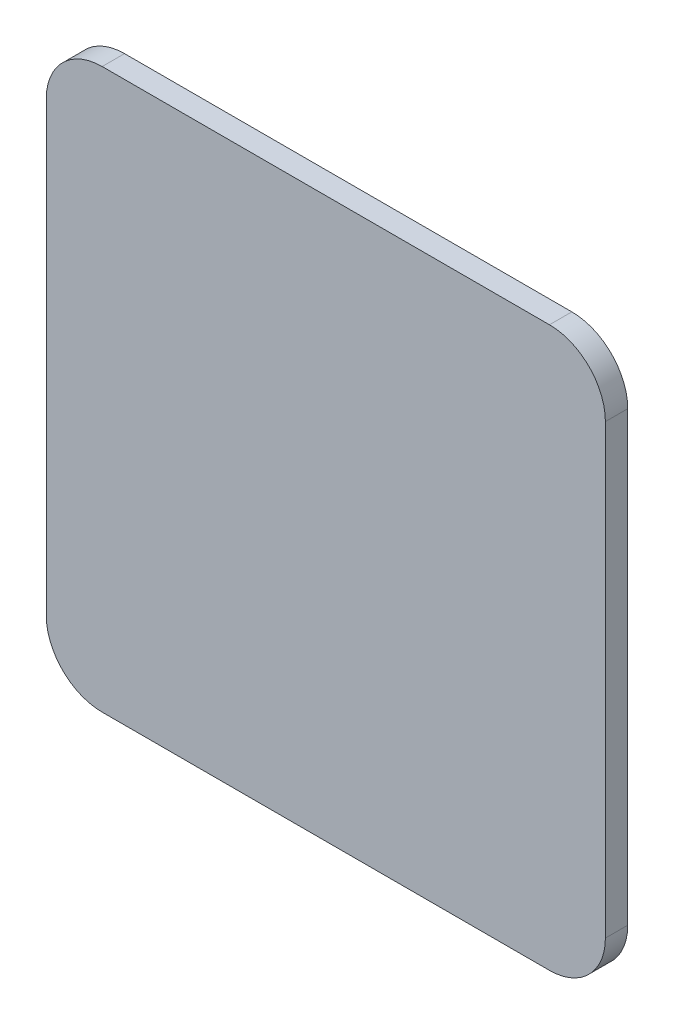
ISO-10303-21;
HEADER;
FILE_DESCRIPTION(('STEP AP214'),'2;1');
FILE_NAME('part.step','',(''),(''),'','','');
FILE_SCHEMA(('AUTOMOTIVE_DESIGN { 1 0 10303 214 1 1 1 1 }'));
ENDSEC;
DATA;
#1=APPLICATION_CONTEXT('core data for automotive mechanical design processes');
#2=APPLICATION_PROTOCOL_DEFINITION('international standard','automotive_design',2000,#1);
#3=PRODUCT_CONTEXT('',#1,'mechanical');
#4=PRODUCT('Part','Part','',(#3));
#5=PRODUCT_RELATED_PRODUCT_CATEGORY('part','',(#4));
#6=PRODUCT_DEFINITION_FORMATION('','',#4);
#7=PRODUCT_DEFINITION_CONTEXT('part definition',#1,'design');
#8=PRODUCT_DEFINITION('design','',#6,#7);
#9=PRODUCT_DEFINITION_SHAPE('','',#8);
#10=(LENGTH_UNIT() NAMED_UNIT(*) SI_UNIT(.MILLI.,.METRE.));
#11=(NAMED_UNIT(*) PLANE_ANGLE_UNIT() SI_UNIT($,.RADIAN.));
#12=(NAMED_UNIT(*) SI_UNIT($,.STERADIAN.) SOLID_ANGLE_UNIT());
#13=UNCERTAINTY_MEASURE_WITH_UNIT(LENGTH_MEASURE(1.E-05),#10,'distance_accuracy_value','');
#14=(GEOMETRIC_REPRESENTATION_CONTEXT(3) GLOBAL_UNCERTAINTY_ASSIGNED_CONTEXT((#13)) GLOBAL_UNIT_ASSIGNED_CONTEXT((#10,
#11,#12)) REPRESENTATION_CONTEXT('',''));
#15=CARTESIAN_POINT('',(0.,0.,0.));
#16=DIRECTION('',(0.,0.,1.));
#17=DIRECTION('',(1.,0.,0.));
#18=AXIS2_PLACEMENT_3D('',#15,#16,#17);
#19=CARTESIAN_POINT('',(0.,0.,0.4));
#20=DIRECTION('',(1.,0.,0.));
#21=DIRECTION('',(0.,0.,-1.));
#22=AXIS2_PLACEMENT_3D('',#19,#20,#21);
#23=PLANE('',#22);
#24=DIRECTION('',(0.,-1.,0.));
#25=VECTOR('',#24,1.);
#26=CARTESIAN_POINT('',(0.,0.,0.));
#27=LINE('',#26,#25);
#28=CARTESIAN_POINT('',(0.,9.,0.));
#29=VERTEX_POINT('',#28);
#30=CARTESIAN_POINT('',(0.,1.,0.));
#31=VERTEX_POINT('',#30);
#32=EDGE_CURVE('E130',#29,#31,#27,.T.);
#33=ORIENTED_EDGE('',*,*,#32,.T.);
#34=DIRECTION('',(0.,0.,-1.));
#35=VECTOR('',#34,1.);
#36=CARTESIAN_POINT('',(0.,1.,0.4));
#37=LINE('',#36,#35);
#38=CARTESIAN_POINT('',(0.,1.,0.4));
#39=VERTEX_POINT('',#38);
#40=EDGE_CURVE('E152',#31,#39,#37,.F.);
#41=ORIENTED_EDGE('',*,*,#40,.T.);
#42=DIRECTION('',(0.,-1.,0.));
#43=VECTOR('',#42,1.);
#44=CARTESIAN_POINT('',(0.,0.,0.4));
#45=LINE('',#44,#43);
#46=CARTESIAN_POINT('',(0.,9.,0.4));
#47=VERTEX_POINT('',#46);
#48=EDGE_CURVE('E128',#47,#39,#45,.T.);
#49=ORIENTED_EDGE('',*,*,#48,.F.);
#50=DIRECTION('',(0.,0.,-1.));
#51=VECTOR('',#50,1.);
#52=CARTESIAN_POINT('',(0.,9.,0.4));
#53=LINE('',#52,#51);
#54=EDGE_CURVE('E149',#47,#29,#53,.T.);
#55=ORIENTED_EDGE('',*,*,#54,.T.);
#56=EDGE_LOOP('',(#33,#41,#49,#55));
#57=FACE_BOUND('',#56,.T.);
#58=ADVANCED_FACE('F33',(#57),#23,.F.);
#59=CARTESIAN_POINT('',(0.,0.,0.4));
#60=DIRECTION('',(0.,1.,0.));
#61=DIRECTION('',(0.,0.,1.));
#62=AXIS2_PLACEMENT_3D('',#59,#60,#61);
#63=PLANE('',#62);
#64=DIRECTION('',(1.,0.,0.));
#65=VECTOR('',#64,1.);
#66=CARTESIAN_POINT('',(0.,0.,0.));
#67=LINE('',#66,#65);
#68=CARTESIAN_POINT('',(1.,0.,0.));
#69=VERTEX_POINT('',#68);
#70=CARTESIAN_POINT('',(9.,0.,0.));
#71=VERTEX_POINT('',#70);
#72=EDGE_CURVE('E126',#69,#71,#67,.T.);
#73=ORIENTED_EDGE('',*,*,#72,.T.);
#74=DIRECTION('',(0.,0.,-1.));
#75=VECTOR('',#74,1.);
#76=CARTESIAN_POINT('',(9.,0.,0.4));
#77=LINE('',#76,#75);
#78=CARTESIAN_POINT('',(9.,0.,0.4));
#79=VERTEX_POINT('',#78);
#80=EDGE_CURVE('E104',#71,#79,#77,.F.);
#81=ORIENTED_EDGE('',*,*,#80,.T.);
#82=DIRECTION('',(1.,0.,0.));
#83=VECTOR('',#82,1.);
#84=CARTESIAN_POINT('',(0.,0.,0.4));
#85=LINE('',#84,#83);
#86=CARTESIAN_POINT('',(1.,0.,0.4));
#87=VERTEX_POINT('',#86);
#88=EDGE_CURVE('E166',#87,#79,#85,.T.);
#89=ORIENTED_EDGE('',*,*,#88,.F.);
#90=DIRECTION('',(0.,0.,-1.));
#91=VECTOR('',#90,1.);
#92=CARTESIAN_POINT('',(1.,0.,0.4));
#93=LINE('',#92,#91);
#94=EDGE_CURVE('E109',#87,#69,#93,.T.);
#95=ORIENTED_EDGE('',*,*,#94,.T.);
#96=EDGE_LOOP('',(#73,#81,#89,#95));
#97=FACE_BOUND('',#96,.T.);
#98=ADVANCED_FACE('F171',(#97),#63,.F.);
#99=CARTESIAN_POINT('',(10.,0.,0.4));
#100=DIRECTION('',(-1.,0.,0.));
#101=DIRECTION('',(0.,0.,1.));
#102=AXIS2_PLACEMENT_3D('',#99,#100,#101);
#103=PLANE('',#102);
#104=DIRECTION('',(0.,1.,0.));
#105=VECTOR('',#104,1.);
#106=CARTESIAN_POINT('',(10.,0.,0.4));
#107=LINE('',#106,#105);
#108=CARTESIAN_POINT('',(10.,1.,0.4));
#109=VERTEX_POINT('',#108);
#110=CARTESIAN_POINT('',(10.,9.,0.4));
#111=VERTEX_POINT('',#110);
#112=EDGE_CURVE('E118',#109,#111,#107,.T.);
#113=ORIENTED_EDGE('',*,*,#112,.F.);
#114=DIRECTION('',(0.,0.,-1.));
#115=VECTOR('',#114,1.);
#116=CARTESIAN_POINT('',(10.,1.,0.4));
#117=LINE('',#116,#115);
#118=CARTESIAN_POINT('',(10.,1.,0.));
#119=VERTEX_POINT('',#118);
#120=EDGE_CURVE('E103',#109,#119,#117,.T.);
#121=ORIENTED_EDGE('',*,*,#120,.T.);
#122=DIRECTION('',(0.,1.,0.));
#123=VECTOR('',#122,1.);
#124=CARTESIAN_POINT('',(10.,0.,0.));
#125=LINE('',#124,#123);
#126=CARTESIAN_POINT('',(10.,9.,0.));
#127=VERTEX_POINT('',#126);
#128=EDGE_CURVE('E116',#119,#127,#125,.T.);
#129=ORIENTED_EDGE('',*,*,#128,.T.);
#130=DIRECTION('',(0.,0.,-1.));
#131=VECTOR('',#130,1.);
#132=CARTESIAN_POINT('',(10.,9.,0.4));
#133=LINE('',#132,#131);
#134=EDGE_CURVE('E120',#127,#111,#133,.F.);
#135=ORIENTED_EDGE('',*,*,#134,.T.);
#136=EDGE_LOOP('',(#113,#121,#129,#135));
#137=FACE_BOUND('',#136,.T.);
#138=ADVANCED_FACE('F115',(#137),#103,.F.);
#139=CARTESIAN_POINT('',(0.,10.,0.4));
#140=DIRECTION('',(0.,-1.,0.));
#141=DIRECTION('',(0.,0.,-1.));
#142=AXIS2_PLACEMENT_3D('',#139,#140,#141);
#143=PLANE('',#142);
#144=DIRECTION('',(-1.,0.,0.));
#145=VECTOR('',#144,1.);
#146=CARTESIAN_POINT('',(0.,10.,0.4));
#147=LINE('',#146,#145);
#148=CARTESIAN_POINT('',(9.,10.,0.4));
#149=VERTEX_POINT('',#148);
#150=CARTESIAN_POINT('',(1.,10.,0.4));
#151=VERTEX_POINT('',#150);
#152=EDGE_CURVE('E134',#149,#151,#147,.T.);
#153=ORIENTED_EDGE('',*,*,#152,.F.);
#154=DIRECTION('',(0.,0.,-1.));
#155=VECTOR('',#154,1.);
#156=CARTESIAN_POINT('',(9.,10.,0.4));
#157=LINE('',#156,#155);
#158=CARTESIAN_POINT('',(9.,10.,0.));
#159=VERTEX_POINT('',#158);
#160=EDGE_CURVE('E11',#149,#159,#157,.T.);
#161=ORIENTED_EDGE('',*,*,#160,.T.);
#162=DIRECTION('',(-1.,0.,0.));
#163=VECTOR('',#162,1.);
#164=CARTESIAN_POINT('',(0.,10.,0.));
#165=LINE('',#164,#163);
#166=CARTESIAN_POINT('',(1.,10.,0.));
#167=VERTEX_POINT('',#166);
#168=EDGE_CURVE('E125',#159,#167,#165,.T.);
#169=ORIENTED_EDGE('',*,*,#168,.T.);
#170=DIRECTION('',(0.,0.,-1.));
#171=VECTOR('',#170,1.);
#172=CARTESIAN_POINT('',(1.,10.,0.4));
#173=LINE('',#172,#171);
#174=EDGE_CURVE('E41',#167,#151,#173,.F.);
#175=ORIENTED_EDGE('',*,*,#174,.T.);
#176=EDGE_LOOP('',(#153,#161,#169,#175));
#177=FACE_BOUND('',#176,.T.);
#178=ADVANCED_FACE('F178',(#177),#143,.F.);
#179=CARTESIAN_POINT('',(0.,0.,0.4));
#180=DIRECTION('',(0.,0.,-1.));
#181=DIRECTION('',(-1.,0.,0.));
#182=AXIS2_PLACEMENT_3D('',#179,#180,#181);
#183=PLANE('',#182);
#184=ORIENTED_EDGE('',*,*,#88,.T.);
#185=CARTESIAN_POINT('',(9.,1.,0.4));
#186=DIRECTION('',(0.,0.,-1.));
#187=DIRECTION('',(-1.,0.,0.));
#188=AXIS2_PLACEMENT_3D('',#185,#186,#187);
#189=CIRCLE('',#188,1.);
#190=EDGE_CURVE('E147',#79,#109,#189,.F.);
#191=ORIENTED_EDGE('',*,*,#190,.T.);
#192=ORIENTED_EDGE('',*,*,#112,.T.);
#193=CARTESIAN_POINT('',(9.,9.,0.4));
#194=DIRECTION('',(0.,0.,-1.));
#195=DIRECTION('',(-1.,0.,0.));
#196=AXIS2_PLACEMENT_3D('',#193,#194,#195);
#197=CIRCLE('',#196,1.);
#198=EDGE_CURVE('E54',#111,#149,#197,.F.);
#199=ORIENTED_EDGE('',*,*,#198,.T.);
#200=ORIENTED_EDGE('',*,*,#152,.T.);
#201=CARTESIAN_POINT('',(1.,9.,0.4));
#202=DIRECTION('',(0.,0.,-1.));
#203=DIRECTION('',(-1.,0.,0.));
#204=AXIS2_PLACEMENT_3D('',#201,#202,#203);
#205=CIRCLE('',#204,1.);
#206=EDGE_CURVE('E142',#151,#47,#205,.F.);
#207=ORIENTED_EDGE('',*,*,#206,.T.);
#208=ORIENTED_EDGE('',*,*,#48,.T.);
#209=CARTESIAN_POINT('',(1.,1.,0.4));
#210=DIRECTION('',(0.,0.,-1.));
#211=DIRECTION('',(-1.,0.,0.));
#212=AXIS2_PLACEMENT_3D('',#209,#210,#211);
#213=CIRCLE('',#212,1.);
#214=EDGE_CURVE('E145',#39,#87,#213,.F.);
#215=ORIENTED_EDGE('',*,*,#214,.T.);
#216=EDGE_LOOP('',(#184,#191,#192,#199,#200,#207,#208,#215));
#217=FACE_BOUND('',#216,.T.);
#218=ADVANCED_FACE('F163',(#217),#183,.F.);
#219=CARTESIAN_POINT('',(0.,0.,0.));
#220=DIRECTION('',(0.,0.,-1.));
#221=DIRECTION('',(-1.,0.,0.));
#222=AXIS2_PLACEMENT_3D('',#219,#220,#221);
#223=PLANE('',#222);
#224=ORIENTED_EDGE('',*,*,#128,.F.);
#225=CARTESIAN_POINT('',(9.,1.,0.));
#226=DIRECTION('',(0.,0.,-1.));
#227=DIRECTION('',(-1.,0.,0.));
#228=AXIS2_PLACEMENT_3D('',#225,#226,#227);
#229=CIRCLE('',#228,1.);
#230=EDGE_CURVE('E99',#119,#71,#229,.T.);
#231=ORIENTED_EDGE('',*,*,#230,.T.);
#232=ORIENTED_EDGE('',*,*,#72,.F.);
#233=CARTESIAN_POINT('',(1.,1.,0.));
#234=DIRECTION('',(0.,0.,-1.));
#235=DIRECTION('',(-1.,0.,0.));
#236=AXIS2_PLACEMENT_3D('',#233,#234,#235);
#237=CIRCLE('',#236,1.);
#238=EDGE_CURVE('E110',#69,#31,#237,.T.);
#239=ORIENTED_EDGE('',*,*,#238,.T.);
#240=ORIENTED_EDGE('',*,*,#32,.F.);
#241=CARTESIAN_POINT('',(1.,9.,0.));
#242=DIRECTION('',(0.,0.,-1.));
#243=DIRECTION('',(-1.,0.,0.));
#244=AXIS2_PLACEMENT_3D('',#241,#242,#243);
#245=CIRCLE('',#244,1.);
#246=EDGE_CURVE('E119',#29,#167,#245,.T.);
#247=ORIENTED_EDGE('',*,*,#246,.T.);
#248=ORIENTED_EDGE('',*,*,#168,.F.);
#249=CARTESIAN_POINT('',(9.,9.,0.));
#250=DIRECTION('',(0.,0.,-1.));
#251=DIRECTION('',(-1.,0.,0.));
#252=AXIS2_PLACEMENT_3D('',#249,#250,#251);
#253=CIRCLE('',#252,1.);
#254=EDGE_CURVE('E124',#159,#127,#253,.T.);
#255=ORIENTED_EDGE('',*,*,#254,.T.);
#256=EDGE_LOOP('',(#224,#231,#232,#239,#240,#247,#248,#255));
#257=FACE_BOUND('',#256,.T.);
#258=ADVANCED_FACE('F122',(#257),#223,.T.);
#259=CARTESIAN_POINT('',(9.,1.,0.4));
#260=DIRECTION('',(0.,0.,-1.));
#261=DIRECTION('',(-1.,0.,0.));
#262=AXIS2_PLACEMENT_3D('',#259,#260,#261);
#263=CYLINDRICAL_SURFACE('',#262,1.);
#264=ORIENTED_EDGE('',*,*,#190,.F.);
#265=ORIENTED_EDGE('',*,*,#80,.F.);
#266=ORIENTED_EDGE('',*,*,#230,.F.);
#267=ORIENTED_EDGE('',*,*,#120,.F.);
#268=EDGE_LOOP('',(#264,#265,#266,#267));
#269=FACE_BOUND('',#268,.T.);
#270=ADVANCED_FACE('F102',(#269),#263,.T.);
#271=CARTESIAN_POINT('',(1.,1.,0.4));
#272=DIRECTION('',(0.,0.,-1.));
#273=DIRECTION('',(-1.,0.,0.));
#274=AXIS2_PLACEMENT_3D('',#271,#272,#273);
#275=CYLINDRICAL_SURFACE('',#274,1.);
#276=ORIENTED_EDGE('',*,*,#214,.F.);
#277=ORIENTED_EDGE('',*,*,#40,.F.);
#278=ORIENTED_EDGE('',*,*,#238,.F.);
#279=ORIENTED_EDGE('',*,*,#94,.F.);
#280=EDGE_LOOP('',(#276,#277,#278,#279));
#281=FACE_BOUND('',#280,.T.);
#282=ADVANCED_FACE('F169',(#281),#275,.T.);
#283=CARTESIAN_POINT('',(9.,9.,0.4));
#284=DIRECTION('',(0.,0.,-1.));
#285=DIRECTION('',(-1.,0.,0.));
#286=AXIS2_PLACEMENT_3D('',#283,#284,#285);
#287=CYLINDRICAL_SURFACE('',#286,1.);
#288=ORIENTED_EDGE('',*,*,#198,.F.);
#289=ORIENTED_EDGE('',*,*,#134,.F.);
#290=ORIENTED_EDGE('',*,*,#254,.F.);
#291=ORIENTED_EDGE('',*,*,#160,.F.);
#292=EDGE_LOOP('',(#288,#289,#290,#291));
#293=FACE_BOUND('',#292,.T.);
#294=ADVANCED_FACE('F177',(#293),#287,.T.);
#295=CARTESIAN_POINT('',(1.,9.,0.4));
#296=DIRECTION('',(0.,0.,-1.));
#297=DIRECTION('',(-1.,0.,0.));
#298=AXIS2_PLACEMENT_3D('',#295,#296,#297);
#299=CYLINDRICAL_SURFACE('',#298,1.);
#300=ORIENTED_EDGE('',*,*,#206,.F.);
#301=ORIENTED_EDGE('',*,*,#174,.F.);
#302=ORIENTED_EDGE('',*,*,#246,.F.);
#303=ORIENTED_EDGE('',*,*,#54,.F.);
#304=EDGE_LOOP('',(#300,#301,#302,#303));
#305=FACE_BOUND('',#304,.T.);
#306=ADVANCED_FACE('F35',(#305),#299,.T.);
#307=CLOSED_SHELL('',(#58,#98,#138,#178,#218,#258,#270,#282,#294,#306));
#308=MANIFOLD_SOLID_BREP('B2',#307);
#309=ADVANCED_BREP_SHAPE_REPRESENTATION('',(#18,#308),#14);
#310=SHAPE_DEFINITION_REPRESENTATION(#9,#309);
ENDSEC;
END-ISO-10303-21;
